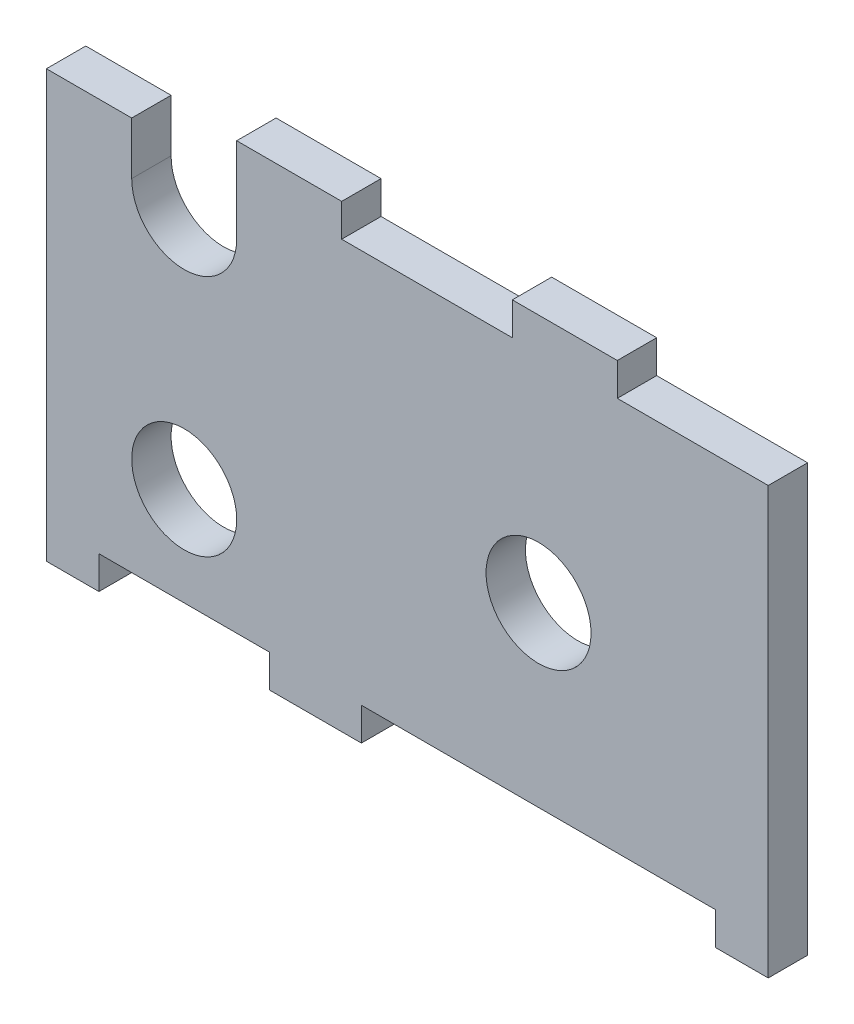
ISO-10303-21;
HEADER;
FILE_DESCRIPTION(('STEP AP214'),'2;1');
FILE_NAME('part.step','',(''),(''),'','','');
FILE_SCHEMA(('AUTOMOTIVE_DESIGN { 1 0 10303 214 1 1 1 1 }'));
ENDSEC;
DATA;
#1=APPLICATION_CONTEXT('core data for automotive mechanical design processes');
#2=APPLICATION_PROTOCOL_DEFINITION('international standard','automotive_design',2000,#1);
#3=PRODUCT_CONTEXT('',#1,'mechanical');
#4=PRODUCT('Part','Part','',(#3));
#5=PRODUCT_RELATED_PRODUCT_CATEGORY('part','',(#4));
#6=PRODUCT_DEFINITION_FORMATION('','',#4);
#7=PRODUCT_DEFINITION_CONTEXT('part definition',#1,'design');
#8=PRODUCT_DEFINITION('design','',#6,#7);
#9=PRODUCT_DEFINITION_SHAPE('','',#8);
#10=(LENGTH_UNIT() NAMED_UNIT(*) SI_UNIT(.MILLI.,.METRE.));
#11=(NAMED_UNIT(*) PLANE_ANGLE_UNIT() SI_UNIT($,.RADIAN.));
#12=(NAMED_UNIT(*) SI_UNIT($,.STERADIAN.) SOLID_ANGLE_UNIT());
#13=UNCERTAINTY_MEASURE_WITH_UNIT(LENGTH_MEASURE(1.E-05),#10,'distance_accuracy_value','');
#14=(GEOMETRIC_REPRESENTATION_CONTEXT(3) GLOBAL_UNCERTAINTY_ASSIGNED_CONTEXT((#13)) GLOBAL_UNIT_ASSIGNED_CONTEXT((#10,
#11,#12)) REPRESENTATION_CONTEXT('',''));
#15=CARTESIAN_POINT('',(0.,0.,0.));
#16=DIRECTION('',(0.,0.,1.));
#17=DIRECTION('',(1.,0.,0.));
#18=AXIS2_PLACEMENT_3D('',#15,#16,#17);
#19=CARTESIAN_POINT('',(-17.0000000000001,11.,3.));
#20=DIRECTION('',(0.,0.,1.));
#21=DIRECTION('',(1.,0.,0.));
#22=AXIS2_PLACEMENT_3D('',#19,#20,#21);
#23=PLANE('',#22);
#24=CARTESIAN_POINT('',(10.,-1.49999999999995,3.));
#25=DIRECTION('',(0.,0.,1.));
#26=DIRECTION('',(1.,0.,0.));
#27=AXIS2_PLACEMENT_3D('',#24,#25,#26);
#28=CIRCLE('',#27,4.);
#29=CARTESIAN_POINT('',(14.,-1.49999999999995,3.));
#30=VERTEX_POINT('',#29);
#31=EDGE_CURVE('E218',#30,#30,#28,.T.);
#32=ORIENTED_EDGE('',*,*,#31,.F.);
#33=EDGE_LOOP('',(#32));
#34=FACE_BOUND('',#33,.T.);
#35=CARTESIAN_POINT('',(-17.0000000000001,11.,3.));
#36=DIRECTION('',(0.,0.,-1.));
#37=DIRECTION('',(1.,0.,0.));
#38=AXIS2_PLACEMENT_3D('',#35,#36,#37);
#39=CIRCLE('',#38,4.);
#40=CARTESIAN_POINT('',(-13.0000000000001,11.,3.));
#41=VERTEX_POINT('',#40);
#42=CARTESIAN_POINT('',(-21.0000000000001,11.,3.));
#43=VERTEX_POINT('',#42);
#44=EDGE_CURVE('E257',#41,#43,#39,.T.);
#45=ORIENTED_EDGE('',*,*,#44,.T.);
#46=DIRECTION('',(0.,1.,0.));
#47=VECTOR('',#46,1.);
#48=CARTESIAN_POINT('',(-21.0000000000001,11.,3.));
#49=LINE('',#48,#47);
#50=CARTESIAN_POINT('',(-21.0000000000001,15.,3.));
#51=VERTEX_POINT('',#50);
#52=EDGE_CURVE('E135',#43,#51,#49,.T.);
#53=ORIENTED_EDGE('',*,*,#52,.T.);
#54=DIRECTION('',(-1.,0.,0.));
#55=VECTOR('',#54,1.);
#56=CARTESIAN_POINT('',(-21.0000000000001,15.,3.));
#57=LINE('',#56,#55);
#58=CARTESIAN_POINT('',(-27.5000000000001,15.,3.));
#59=VERTEX_POINT('',#58);
#60=EDGE_CURVE('E314',#51,#59,#57,.T.);
#61=ORIENTED_EDGE('',*,*,#60,.T.);
#62=DIRECTION('',(0.,-1.,0.));
#63=VECTOR('',#62,1.);
#64=CARTESIAN_POINT('',(-27.5000000000001,15.,3.));
#65=LINE('',#64,#63);
#66=CARTESIAN_POINT('',(-27.5000000000001,-17.5000000000001,3.));
#67=VERTEX_POINT('',#66);
#68=EDGE_CURVE('E333',#59,#67,#65,.T.);
#69=ORIENTED_EDGE('',*,*,#68,.T.);
#70=DIRECTION('',(1.,0.,0.));
#71=VECTOR('',#70,1.);
#72=CARTESIAN_POINT('',(-23.5000000000001,-17.5000000000001,3.));
#73=LINE('',#72,#71);
#74=CARTESIAN_POINT('',(-23.5000000000001,-17.5000000000001,3.));
#75=VERTEX_POINT('',#74);
#76=EDGE_CURVE('E330',#67,#75,#73,.T.);
#77=ORIENTED_EDGE('',*,*,#76,.T.);
#78=DIRECTION('',(0.,1.,0.));
#79=VECTOR('',#78,1.);
#80=CARTESIAN_POINT('',(-23.5000000000001,-17.5000000000001,3.));
#81=LINE('',#80,#79);
#82=CARTESIAN_POINT('',(-23.5000000000001,-14.9999999999999,3.));
#83=VERTEX_POINT('',#82);
#84=EDGE_CURVE('E332',#75,#83,#81,.T.);
#85=ORIENTED_EDGE('',*,*,#84,.T.);
#86=DIRECTION('',(1.,0.,0.));
#87=VECTOR('',#86,1.);
#88=CARTESIAN_POINT('',(-23.5000000000001,-14.9999999999999,3.));
#89=LINE('',#88,#87);
#90=CARTESIAN_POINT('',(-10.4999999999991,-14.9999999999999,3.));
#91=VERTEX_POINT('',#90);
#92=EDGE_CURVE('E335',#83,#91,#89,.T.);
#93=ORIENTED_EDGE('',*,*,#92,.T.);
#94=DIRECTION('',(0.,-1.,0.));
#95=VECTOR('',#94,1.);
#96=CARTESIAN_POINT('',(-10.4999999999991,-17.5000000000001,3.));
#97=LINE('',#96,#95);
#98=CARTESIAN_POINT('',(-10.4999999999991,-17.5000000000001,3.));
#99=VERTEX_POINT('',#98);
#100=EDGE_CURVE('E341',#91,#99,#97,.T.);
#101=ORIENTED_EDGE('',*,*,#100,.T.);
#102=DIRECTION('',(1.,0.,0.));
#103=VECTOR('',#102,1.);
#104=CARTESIAN_POINT('',(-3.49999999999961,-17.5000000000001,3.));
#105=LINE('',#104,#103);
#106=CARTESIAN_POINT('',(-3.49999999999961,-17.5000000000001,3.));
#107=VERTEX_POINT('',#106);
#108=EDGE_CURVE('E343',#99,#107,#105,.T.);
#109=ORIENTED_EDGE('',*,*,#108,.T.);
#110=DIRECTION('',(0.,1.,0.));
#111=VECTOR('',#110,1.);
#112=CARTESIAN_POINT('',(-3.49999999999961,-17.5000000000001,3.));
#113=LINE('',#112,#111);
#114=CARTESIAN_POINT('',(-3.49999999999961,-14.9999999999999,3.));
#115=VERTEX_POINT('',#114);
#116=EDGE_CURVE('E345',#107,#115,#113,.T.);
#117=ORIENTED_EDGE('',*,*,#116,.T.);
#118=DIRECTION('',(1.,0.,0.));
#119=VECTOR('',#118,1.);
#120=CARTESIAN_POINT('',(-3.49999999999961,-14.9999999999999,3.));
#121=LINE('',#120,#119);
#122=CARTESIAN_POINT('',(23.5000000000003,-14.9999999999999,3.));
#123=VERTEX_POINT('',#122);
#124=EDGE_CURVE('E347',#115,#123,#121,.T.);
#125=ORIENTED_EDGE('',*,*,#124,.T.);
#126=DIRECTION('',(0.,-1.,0.));
#127=VECTOR('',#126,1.);
#128=CARTESIAN_POINT('',(23.5000000000003,-17.5000000000001,3.));
#129=LINE('',#128,#127);
#130=CARTESIAN_POINT('',(23.5000000000003,-17.5000000000001,3.));
#131=VERTEX_POINT('',#130);
#132=EDGE_CURVE('E349',#123,#131,#129,.T.);
#133=ORIENTED_EDGE('',*,*,#132,.T.);
#134=DIRECTION('',(1.,0.,0.));
#135=VECTOR('',#134,1.);
#136=CARTESIAN_POINT('',(27.4999999999999,-17.5000000000001,3.));
#137=LINE('',#136,#135);
#138=CARTESIAN_POINT('',(27.4999999999999,-17.5000000000001,3.));
#139=VERTEX_POINT('',#138);
#140=EDGE_CURVE('E351',#131,#139,#137,.T.);
#141=ORIENTED_EDGE('',*,*,#140,.T.);
#142=DIRECTION('',(0.,1.,0.));
#143=VECTOR('',#142,1.);
#144=CARTESIAN_POINT('',(27.4999999999999,-17.5000000000001,3.));
#145=LINE('',#144,#143);
#146=CARTESIAN_POINT('',(27.4999999999999,15.,3.));
#147=VERTEX_POINT('',#146);
#148=EDGE_CURVE('E353',#139,#147,#145,.T.);
#149=ORIENTED_EDGE('',*,*,#148,.T.);
#150=DIRECTION('',(-1.,0.,0.));
#151=VECTOR('',#150,1.);
#152=CARTESIAN_POINT('',(27.4999999999999,15.,3.));
#153=LINE('',#152,#151);
#154=CARTESIAN_POINT('',(16.,15.,3.));
#155=VERTEX_POINT('',#154);
#156=EDGE_CURVE('E355',#147,#155,#153,.T.);
#157=ORIENTED_EDGE('',*,*,#156,.T.);
#158=DIRECTION('',(0.,1.,0.));
#159=VECTOR('',#158,1.);
#160=CARTESIAN_POINT('',(16.,17.5000000000001,3.));
#161=LINE('',#160,#159);
#162=CARTESIAN_POINT('',(16.,17.5000000000001,3.));
#163=VERTEX_POINT('',#162);
#164=EDGE_CURVE('E357',#155,#163,#161,.T.);
#165=ORIENTED_EDGE('',*,*,#164,.T.);
#166=DIRECTION('',(-1.,0.,0.));
#167=VECTOR('',#166,1.);
#168=CARTESIAN_POINT('',(8.00000000000023,17.5000000000001,3.));
#169=LINE('',#168,#167);
#170=CARTESIAN_POINT('',(8.00000000000023,17.5000000000001,3.));
#171=VERTEX_POINT('',#170);
#172=EDGE_CURVE('E359',#163,#171,#169,.T.);
#173=ORIENTED_EDGE('',*,*,#172,.T.);
#174=DIRECTION('',(0.,-1.,0.));
#175=VECTOR('',#174,1.);
#176=CARTESIAN_POINT('',(8.00000000000023,17.5000000000001,3.));
#177=LINE('',#176,#175);
#178=CARTESIAN_POINT('',(8.00000000000023,15.0000000000001,3.));
#179=VERTEX_POINT('',#178);
#180=EDGE_CURVE('E361',#171,#179,#177,.T.);
#181=ORIENTED_EDGE('',*,*,#180,.T.);
#182=DIRECTION('',(-1.,0.,0.));
#183=VECTOR('',#182,1.);
#184=CARTESIAN_POINT('',(8.00000000000023,15.0000000000001,3.));
#185=LINE('',#184,#183);
#186=CARTESIAN_POINT('',(-5.00000000000012,15.0000000000001,3.));
#187=VERTEX_POINT('',#186);
#188=EDGE_CURVE('E196',#179,#187,#185,.T.);
#189=ORIENTED_EDGE('',*,*,#188,.T.);
#190=DIRECTION('',(0.,1.,0.));
#191=VECTOR('',#190,1.);
#192=CARTESIAN_POINT('',(-5.00000000000012,17.5000000000001,3.));
#193=LINE('',#192,#191);
#194=CARTESIAN_POINT('',(-5.00000000000012,17.5000000000001,3.));
#195=VERTEX_POINT('',#194);
#196=EDGE_CURVE('E190',#187,#195,#193,.T.);
#197=ORIENTED_EDGE('',*,*,#196,.T.);
#198=DIRECTION('',(-1.,0.,0.));
#199=VECTOR('',#198,1.);
#200=CARTESIAN_POINT('',(-13.0000000000001,17.5000000000001,3.));
#201=LINE('',#200,#199);
#202=CARTESIAN_POINT('',(-13.0000000000001,17.5000000000001,3.));
#203=VERTEX_POINT('',#202);
#204=EDGE_CURVE('E194',#195,#203,#201,.T.);
#205=ORIENTED_EDGE('',*,*,#204,.T.);
#206=DIRECTION('',(0.,-1.,0.));
#207=VECTOR('',#206,1.);
#208=CARTESIAN_POINT('',(-13.0000000000001,17.5000000000001,3.));
#209=LINE('',#208,#207);
#210=EDGE_CURVE('E50',#203,#41,#209,.T.);
#211=ORIENTED_EDGE('',*,*,#210,.T.);
#212=EDGE_LOOP('',(#45,#53,#61,#69,#77,#85,#93,#101,#109,#117,#125,#133,#141,#149,#157,#165,
#173,#181,#189,#197,#205,#211));
#213=FACE_BOUND('',#212,.T.);
#214=CARTESIAN_POINT('',(-17.0000000000001,-7.49999999999995,3.));
#215=DIRECTION('',(0.,0.,1.));
#216=DIRECTION('',(1.,0.,0.));
#217=AXIS2_PLACEMENT_3D('',#214,#215,#216);
#218=CIRCLE('',#217,4.);
#219=CARTESIAN_POINT('',(-13.0000000000001,-7.49999999999995,3.));
#220=VERTEX_POINT('',#219);
#221=EDGE_CURVE('E403',#220,#220,#218,.T.);
#222=ORIENTED_EDGE('',*,*,#221,.F.);
#223=EDGE_LOOP('',(#222));
#224=FACE_BOUND('',#223,.T.);
#225=ADVANCED_FACE('F33',(#34,#213,#224),#23,.T.);
#226=CARTESIAN_POINT('',(-17.0000000000001,11.,0.));
#227=DIRECTION('',(0.,0.,1.));
#228=DIRECTION('',(1.,0.,0.));
#229=AXIS2_PLACEMENT_3D('',#226,#227,#228);
#230=PLANE('',#229);
#231=CARTESIAN_POINT('',(-17.0000000000001,11.,0.));
#232=DIRECTION('',(0.,0.,-1.));
#233=DIRECTION('',(1.,0.,0.));
#234=AXIS2_PLACEMENT_3D('',#231,#232,#233);
#235=CIRCLE('',#234,4.);
#236=CARTESIAN_POINT('',(-13.0000000000001,11.,0.));
#237=VERTEX_POINT('',#236);
#238=CARTESIAN_POINT('',(-21.0000000000001,11.,0.));
#239=VERTEX_POINT('',#238);
#240=EDGE_CURVE('E214',#237,#239,#235,.T.);
#241=ORIENTED_EDGE('',*,*,#240,.F.);
#242=DIRECTION('',(0.,-1.,0.));
#243=VECTOR('',#242,1.);
#244=CARTESIAN_POINT('',(-13.0000000000001,17.5000000000001,0.));
#245=LINE('',#244,#243);
#246=CARTESIAN_POINT('',(-13.0000000000001,17.5000000000001,0.));
#247=VERTEX_POINT('',#246);
#248=EDGE_CURVE('E127',#247,#237,#245,.T.);
#249=ORIENTED_EDGE('',*,*,#248,.F.);
#250=DIRECTION('',(-1.,0.,0.));
#251=VECTOR('',#250,1.);
#252=CARTESIAN_POINT('',(-13.0000000000001,17.5000000000001,0.));
#253=LINE('',#252,#251);
#254=CARTESIAN_POINT('',(-5.00000000000012,17.5000000000001,0.));
#255=VERTEX_POINT('',#254);
#256=EDGE_CURVE('E121',#255,#247,#253,.T.);
#257=ORIENTED_EDGE('',*,*,#256,.F.);
#258=DIRECTION('',(0.,1.,0.));
#259=VECTOR('',#258,1.);
#260=CARTESIAN_POINT('',(-5.00000000000012,17.5000000000001,0.));
#261=LINE('',#260,#259);
#262=CARTESIAN_POINT('',(-5.00000000000012,15.0000000000001,0.));
#263=VERTEX_POINT('',#262);
#264=EDGE_CURVE('E204',#263,#255,#261,.T.);
#265=ORIENTED_EDGE('',*,*,#264,.F.);
#266=DIRECTION('',(-1.,0.,0.));
#267=VECTOR('',#266,1.);
#268=CARTESIAN_POINT('',(8.00000000000023,15.0000000000001,0.));
#269=LINE('',#268,#267);
#270=CARTESIAN_POINT('',(8.00000000000023,15.0000000000001,0.));
#271=VERTEX_POINT('',#270);
#272=EDGE_CURVE('E252',#271,#263,#269,.T.);
#273=ORIENTED_EDGE('',*,*,#272,.F.);
#274=DIRECTION('',(0.,-1.,0.));
#275=VECTOR('',#274,1.);
#276=CARTESIAN_POINT('',(8.00000000000023,17.5000000000001,0.));
#277=LINE('',#276,#275);
#278=CARTESIAN_POINT('',(8.00000000000023,17.5000000000001,0.));
#279=VERTEX_POINT('',#278);
#280=EDGE_CURVE('E250',#279,#271,#277,.T.);
#281=ORIENTED_EDGE('',*,*,#280,.F.);
#282=DIRECTION('',(-1.,0.,0.));
#283=VECTOR('',#282,1.);
#284=CARTESIAN_POINT('',(8.00000000000023,17.5000000000001,0.));
#285=LINE('',#284,#283);
#286=CARTESIAN_POINT('',(16.,17.5000000000001,0.));
#287=VERTEX_POINT('',#286);
#288=EDGE_CURVE('E248',#287,#279,#285,.T.);
#289=ORIENTED_EDGE('',*,*,#288,.F.);
#290=DIRECTION('',(0.,1.,0.));
#291=VECTOR('',#290,1.);
#292=CARTESIAN_POINT('',(16.,17.5000000000001,0.));
#293=LINE('',#292,#291);
#294=CARTESIAN_POINT('',(16.,15.,0.));
#295=VERTEX_POINT('',#294);
#296=EDGE_CURVE('E246',#295,#287,#293,.T.);
#297=ORIENTED_EDGE('',*,*,#296,.F.);
#298=DIRECTION('',(-1.,0.,0.));
#299=VECTOR('',#298,1.);
#300=CARTESIAN_POINT('',(27.4999999999999,15.,0.));
#301=LINE('',#300,#299);
#302=CARTESIAN_POINT('',(27.4999999999999,15.,0.));
#303=VERTEX_POINT('',#302);
#304=EDGE_CURVE('E244',#303,#295,#301,.T.);
#305=ORIENTED_EDGE('',*,*,#304,.F.);
#306=DIRECTION('',(0.,1.,0.));
#307=VECTOR('',#306,1.);
#308=CARTESIAN_POINT('',(27.4999999999999,-17.5000000000001,0.));
#309=LINE('',#308,#307);
#310=CARTESIAN_POINT('',(27.4999999999999,-17.5000000000001,0.));
#311=VERTEX_POINT('',#310);
#312=EDGE_CURVE('E242',#311,#303,#309,.T.);
#313=ORIENTED_EDGE('',*,*,#312,.F.);
#314=DIRECTION('',(1.,0.,0.));
#315=VECTOR('',#314,1.);
#316=CARTESIAN_POINT('',(27.4999999999999,-17.5000000000001,0.));
#317=LINE('',#316,#315);
#318=CARTESIAN_POINT('',(23.5000000000003,-17.5000000000001,0.));
#319=VERTEX_POINT('',#318);
#320=EDGE_CURVE('E240',#319,#311,#317,.T.);
#321=ORIENTED_EDGE('',*,*,#320,.F.);
#322=DIRECTION('',(0.,-1.,0.));
#323=VECTOR('',#322,1.);
#324=CARTESIAN_POINT('',(23.5000000000003,-17.5000000000001,0.));
#325=LINE('',#324,#323);
#326=CARTESIAN_POINT('',(23.5000000000003,-14.9999999999999,0.));
#327=VERTEX_POINT('',#326);
#328=EDGE_CURVE('E238',#327,#319,#325,.T.);
#329=ORIENTED_EDGE('',*,*,#328,.F.);
#330=DIRECTION('',(1.,0.,0.));
#331=VECTOR('',#330,1.);
#332=CARTESIAN_POINT('',(-3.49999999999961,-14.9999999999999,0.));
#333=LINE('',#332,#331);
#334=CARTESIAN_POINT('',(-3.49999999999961,-14.9999999999999,0.));
#335=VERTEX_POINT('',#334);
#336=EDGE_CURVE('E236',#335,#327,#333,.T.);
#337=ORIENTED_EDGE('',*,*,#336,.F.);
#338=DIRECTION('',(0.,1.,0.));
#339=VECTOR('',#338,1.);
#340=CARTESIAN_POINT('',(-3.49999999999961,-17.5000000000001,0.));
#341=LINE('',#340,#339);
#342=CARTESIAN_POINT('',(-3.49999999999961,-17.5000000000001,0.));
#343=VERTEX_POINT('',#342);
#344=EDGE_CURVE('E234',#343,#335,#341,.T.);
#345=ORIENTED_EDGE('',*,*,#344,.F.);
#346=DIRECTION('',(1.,0.,0.));
#347=VECTOR('',#346,1.);
#348=CARTESIAN_POINT('',(-3.49999999999961,-17.5000000000001,0.));
#349=LINE('',#348,#347);
#350=CARTESIAN_POINT('',(-10.4999999999991,-17.5000000000001,0.));
#351=VERTEX_POINT('',#350);
#352=EDGE_CURVE('E232',#351,#343,#349,.T.);
#353=ORIENTED_EDGE('',*,*,#352,.F.);
#354=DIRECTION('',(0.,-1.,0.));
#355=VECTOR('',#354,1.);
#356=CARTESIAN_POINT('',(-10.4999999999991,-17.5000000000001,0.));
#357=LINE('',#356,#355);
#358=CARTESIAN_POINT('',(-10.4999999999991,-14.9999999999999,0.));
#359=VERTEX_POINT('',#358);
#360=EDGE_CURVE('E230',#359,#351,#357,.T.);
#361=ORIENTED_EDGE('',*,*,#360,.F.);
#362=DIRECTION('',(1.,0.,0.));
#363=VECTOR('',#362,1.);
#364=CARTESIAN_POINT('',(-23.5000000000001,-14.9999999999999,0.));
#365=LINE('',#364,#363);
#366=CARTESIAN_POINT('',(-23.5000000000001,-14.9999999999999,0.));
#367=VERTEX_POINT('',#366);
#368=EDGE_CURVE('E228',#367,#359,#365,.T.);
#369=ORIENTED_EDGE('',*,*,#368,.F.);
#370=DIRECTION('',(0.,1.,0.));
#371=VECTOR('',#370,1.);
#372=CARTESIAN_POINT('',(-23.5000000000001,-17.5000000000001,0.));
#373=LINE('',#372,#371);
#374=CARTESIAN_POINT('',(-23.5000000000001,-17.5000000000001,0.));
#375=VERTEX_POINT('',#374);
#376=EDGE_CURVE('E226',#375,#367,#373,.T.);
#377=ORIENTED_EDGE('',*,*,#376,.F.);
#378=DIRECTION('',(1.,0.,0.));
#379=VECTOR('',#378,1.);
#380=CARTESIAN_POINT('',(-23.5000000000001,-17.5000000000001,0.));
#381=LINE('',#380,#379);
#382=CARTESIAN_POINT('',(-27.5000000000001,-17.5000000000001,0.));
#383=VERTEX_POINT('',#382);
#384=EDGE_CURVE('E224',#383,#375,#381,.T.);
#385=ORIENTED_EDGE('',*,*,#384,.F.);
#386=DIRECTION('',(0.,-1.,0.));
#387=VECTOR('',#386,1.);
#388=CARTESIAN_POINT('',(-27.5000000000001,15.,0.));
#389=LINE('',#388,#387);
#390=CARTESIAN_POINT('',(-27.5000000000001,15.,0.));
#391=VERTEX_POINT('',#390);
#392=EDGE_CURVE('E222',#391,#383,#389,.T.);
#393=ORIENTED_EDGE('',*,*,#392,.F.);
#394=DIRECTION('',(-1.,0.,0.));
#395=VECTOR('',#394,1.);
#396=CARTESIAN_POINT('',(-21.0000000000001,15.,0.));
#397=LINE('',#396,#395);
#398=CARTESIAN_POINT('',(-21.0000000000001,15.,0.));
#399=VERTEX_POINT('',#398);
#400=EDGE_CURVE('E220',#399,#391,#397,.T.);
#401=ORIENTED_EDGE('',*,*,#400,.F.);
#402=DIRECTION('',(0.,1.,0.));
#403=VECTOR('',#402,1.);
#404=CARTESIAN_POINT('',(-21.0000000000001,11.,0.));
#405=LINE('',#404,#403);
#406=EDGE_CURVE('E217',#239,#399,#405,.T.);
#407=ORIENTED_EDGE('',*,*,#406,.F.);
#408=EDGE_LOOP('',(#241,#249,#257,#265,#273,#281,#289,#297,#305,#313,#321,#329,#337,#345,#353,
#361,#369,#377,#385,#393,#401,#407));
#409=FACE_BOUND('',#408,.T.);
#410=CARTESIAN_POINT('',(10.,-1.49999999999995,0.));
#411=DIRECTION('',(0.,0.,1.));
#412=DIRECTION('',(1.,0.,0.));
#413=AXIS2_PLACEMENT_3D('',#410,#411,#412);
#414=CIRCLE('',#413,4.);
#415=CARTESIAN_POINT('',(14.,-1.49999999999995,0.));
#416=VERTEX_POINT('',#415);
#417=EDGE_CURVE('E409',#416,#416,#414,.T.);
#418=ORIENTED_EDGE('',*,*,#417,.T.);
#419=EDGE_LOOP('',(#418));
#420=FACE_BOUND('',#419,.T.);
#421=CARTESIAN_POINT('',(-17.0000000000001,-7.49999999999995,0.));
#422=DIRECTION('',(0.,0.,1.));
#423=DIRECTION('',(1.,0.,0.));
#424=AXIS2_PLACEMENT_3D('',#421,#422,#423);
#425=CIRCLE('',#424,4.);
#426=CARTESIAN_POINT('',(-13.0000000000001,-7.49999999999995,0.));
#427=VERTEX_POINT('',#426);
#428=EDGE_CURVE('E406',#427,#427,#425,.T.);
#429=ORIENTED_EDGE('',*,*,#428,.T.);
#430=EDGE_LOOP('',(#429));
#431=FACE_BOUND('',#430,.T.);
#432=ADVANCED_FACE('F318',(#409,#420,#431),#230,.F.);
#433=CARTESIAN_POINT('',(-17.0000000000001,11.,3.));
#434=DIRECTION('',(0.,0.,-1.));
#435=DIRECTION('',(-1.,0.,0.));
#436=AXIS2_PLACEMENT_3D('',#433,#434,#435);
#437=CYLINDRICAL_SURFACE('',#436,4.);
#438=ORIENTED_EDGE('',*,*,#240,.T.);
#439=DIRECTION('',(0.,0.,-1.));
#440=VECTOR('',#439,1.);
#441=CARTESIAN_POINT('',(-21.0000000000001,11.,3.));
#442=LINE('',#441,#440);
#443=EDGE_CURVE('E11',#43,#239,#442,.T.);
#444=ORIENTED_EDGE('',*,*,#443,.F.);
#445=ORIENTED_EDGE('',*,*,#44,.F.);
#446=DIRECTION('',(0.,0.,-1.));
#447=VECTOR('',#446,1.);
#448=CARTESIAN_POINT('',(-13.0000000000001,11.,3.));
#449=LINE('',#448,#447);
#450=EDGE_CURVE('E210',#41,#237,#449,.T.);
#451=ORIENTED_EDGE('',*,*,#450,.T.);
#452=EDGE_LOOP('',(#438,#444,#445,#451));
#453=FACE_BOUND('',#452,.T.);
#454=ADVANCED_FACE('F35',(#453),#437,.F.);
#455=CARTESIAN_POINT('',(-21.0000000000001,11.,3.));
#456=DIRECTION('',(-1.,0.,0.));
#457=DIRECTION('',(0.,0.,1.));
#458=AXIS2_PLACEMENT_3D('',#455,#456,#457);
#459=PLANE('',#458);
#460=ORIENTED_EDGE('',*,*,#406,.T.);
#461=DIRECTION('',(0.,0.,-1.));
#462=VECTOR('',#461,1.);
#463=CARTESIAN_POINT('',(-21.0000000000001,15.,3.));
#464=LINE('',#463,#462);
#465=EDGE_CURVE('E42',#51,#399,#464,.T.);
#466=ORIENTED_EDGE('',*,*,#465,.F.);
#467=ORIENTED_EDGE('',*,*,#52,.F.);
#468=ORIENTED_EDGE('',*,*,#443,.T.);
#469=EDGE_LOOP('',(#460,#466,#467,#468));
#470=FACE_BOUND('',#469,.T.);
#471=ADVANCED_FACE('F602',(#470),#459,.F.);
#472=CARTESIAN_POINT('',(-21.0000000000001,15.,3.));
#473=DIRECTION('',(0.,-1.,0.));
#474=DIRECTION('',(1.,0.,0.));
#475=AXIS2_PLACEMENT_3D('',#472,#473,#474);
#476=PLANE('',#475);
#477=ORIENTED_EDGE('',*,*,#400,.T.);
#478=DIRECTION('',(0.,0.,-1.));
#479=VECTOR('',#478,1.);
#480=CARTESIAN_POINT('',(-27.5000000000001,15.,3.));
#481=LINE('',#480,#479);
#482=EDGE_CURVE('E306',#59,#391,#481,.T.);
#483=ORIENTED_EDGE('',*,*,#482,.F.);
#484=ORIENTED_EDGE('',*,*,#60,.F.);
#485=ORIENTED_EDGE('',*,*,#465,.T.);
#486=EDGE_LOOP('',(#477,#483,#484,#485));
#487=FACE_BOUND('',#486,.T.);
#488=ADVANCED_FACE('F312',(#487),#476,.F.);
#489=CARTESIAN_POINT('',(-27.5000000000001,15.,3.));
#490=DIRECTION('',(1.,0.,0.));
#491=DIRECTION('',(0.,1.,0.));
#492=AXIS2_PLACEMENT_3D('',#489,#490,#491);
#493=PLANE('',#492);
#494=ORIENTED_EDGE('',*,*,#392,.T.);
#495=DIRECTION('',(0.,0.,-1.));
#496=VECTOR('',#495,1.);
#497=CARTESIAN_POINT('',(-27.5000000000001,-17.5000000000001,3.));
#498=LINE('',#497,#496);
#499=EDGE_CURVE('E303',#67,#383,#498,.T.);
#500=ORIENTED_EDGE('',*,*,#499,.F.);
#501=ORIENTED_EDGE('',*,*,#68,.F.);
#502=ORIENTED_EDGE('',*,*,#482,.T.);
#503=EDGE_LOOP('',(#494,#500,#501,#502));
#504=FACE_BOUND('',#503,.T.);
#505=ADVANCED_FACE('F324',(#504),#493,.F.);
#506=CARTESIAN_POINT('',(-23.5000000000001,-17.5000000000001,3.));
#507=DIRECTION('',(0.,1.,0.));
#508=DIRECTION('',(0.,0.,1.));
#509=AXIS2_PLACEMENT_3D('',#506,#507,#508);
#510=PLANE('',#509);
#511=ORIENTED_EDGE('',*,*,#384,.T.);
#512=DIRECTION('',(0.,0.,-1.));
#513=VECTOR('',#512,1.);
#514=CARTESIAN_POINT('',(-23.5000000000001,-17.5000000000001,3.));
#515=LINE('',#514,#513);
#516=EDGE_CURVE('E300',#75,#375,#515,.T.);
#517=ORIENTED_EDGE('',*,*,#516,.F.);
#518=ORIENTED_EDGE('',*,*,#76,.F.);
#519=ORIENTED_EDGE('',*,*,#499,.T.);
#520=EDGE_LOOP('',(#511,#517,#518,#519));
#521=FACE_BOUND('',#520,.T.);
#522=ADVANCED_FACE('F328',(#521),#510,.F.);
#523=CARTESIAN_POINT('',(-23.5000000000001,-17.5000000000001,3.));
#524=DIRECTION('',(-1.,0.,0.));
#525=DIRECTION('',(0.,0.,1.));
#526=AXIS2_PLACEMENT_3D('',#523,#524,#525);
#527=PLANE('',#526);
#528=ORIENTED_EDGE('',*,*,#376,.T.);
#529=DIRECTION('',(0.,0.,-1.));
#530=VECTOR('',#529,1.);
#531=CARTESIAN_POINT('',(-23.5000000000001,-14.9999999999999,3.));
#532=LINE('',#531,#530);
#533=EDGE_CURVE('E297',#83,#367,#532,.T.);
#534=ORIENTED_EDGE('',*,*,#533,.F.);
#535=ORIENTED_EDGE('',*,*,#84,.F.);
#536=ORIENTED_EDGE('',*,*,#516,.T.);
#537=EDGE_LOOP('',(#528,#534,#535,#536));
#538=FACE_BOUND('',#537,.T.);
#539=ADVANCED_FACE('F567',(#538),#527,.F.);
#540=CARTESIAN_POINT('',(-23.5000000000001,-14.9999999999999,3.));
#541=DIRECTION('',(0.,1.,0.));
#542=DIRECTION('',(0.,0.,1.));
#543=AXIS2_PLACEMENT_3D('',#540,#541,#542);
#544=PLANE('',#543);
#545=ORIENTED_EDGE('',*,*,#368,.T.);
#546=DIRECTION('',(0.,0.,-1.));
#547=VECTOR('',#546,1.);
#548=CARTESIAN_POINT('',(-10.4999999999991,-14.9999999999999,3.));
#549=LINE('',#548,#547);
#550=EDGE_CURVE('E294',#91,#359,#549,.T.);
#551=ORIENTED_EDGE('',*,*,#550,.F.);
#552=ORIENTED_EDGE('',*,*,#92,.F.);
#553=ORIENTED_EDGE('',*,*,#533,.T.);
#554=EDGE_LOOP('',(#545,#551,#552,#553));
#555=FACE_BOUND('',#554,.T.);
#556=ADVANCED_FACE('F557',(#555),#544,.F.);
#557=CARTESIAN_POINT('',(-10.4999999999991,-17.5000000000001,3.));
#558=DIRECTION('',(1.,0.,0.));
#559=DIRECTION('',(0.,0.,-1.));
#560=AXIS2_PLACEMENT_3D('',#557,#558,#559);
#561=PLANE('',#560);
#562=ORIENTED_EDGE('',*,*,#360,.T.);
#563=DIRECTION('',(0.,0.,-1.));
#564=VECTOR('',#563,1.);
#565=CARTESIAN_POINT('',(-10.4999999999991,-17.5000000000001,3.));
#566=LINE('',#565,#564);
#567=EDGE_CURVE('E291',#99,#351,#566,.T.);
#568=ORIENTED_EDGE('',*,*,#567,.F.);
#569=ORIENTED_EDGE('',*,*,#100,.F.);
#570=ORIENTED_EDGE('',*,*,#550,.T.);
#571=EDGE_LOOP('',(#562,#568,#569,#570));
#572=FACE_BOUND('',#571,.T.);
#573=ADVANCED_FACE('F547',(#572),#561,.F.);
#574=CARTESIAN_POINT('',(-3.49999999999961,-17.5000000000001,3.));
#575=DIRECTION('',(0.,1.,0.));
#576=DIRECTION('',(-1.,0.,0.));
#577=AXIS2_PLACEMENT_3D('',#574,#575,#576);
#578=PLANE('',#577);
#579=ORIENTED_EDGE('',*,*,#352,.T.);
#580=DIRECTION('',(0.,0.,-1.));
#581=VECTOR('',#580,1.);
#582=CARTESIAN_POINT('',(-3.49999999999961,-17.5000000000001,3.));
#583=LINE('',#582,#581);
#584=EDGE_CURVE('E288',#107,#343,#583,.T.);
#585=ORIENTED_EDGE('',*,*,#584,.F.);
#586=ORIENTED_EDGE('',*,*,#108,.F.);
#587=ORIENTED_EDGE('',*,*,#567,.T.);
#588=EDGE_LOOP('',(#579,#585,#586,#587));
#589=FACE_BOUND('',#588,.T.);
#590=ADVANCED_FACE('F537',(#589),#578,.F.);
#591=CARTESIAN_POINT('',(-3.49999999999961,-17.5000000000001,3.));
#592=DIRECTION('',(-1.,0.,0.));
#593=DIRECTION('',(0.,-1.,0.));
#594=AXIS2_PLACEMENT_3D('',#591,#592,#593);
#595=PLANE('',#594);
#596=ORIENTED_EDGE('',*,*,#344,.T.);
#597=DIRECTION('',(0.,0.,-1.));
#598=VECTOR('',#597,1.);
#599=CARTESIAN_POINT('',(-3.49999999999961,-14.9999999999999,3.));
#600=LINE('',#599,#598);
#601=EDGE_CURVE('E285',#115,#335,#600,.T.);
#602=ORIENTED_EDGE('',*,*,#601,.F.);
#603=ORIENTED_EDGE('',*,*,#116,.F.);
#604=ORIENTED_EDGE('',*,*,#584,.T.);
#605=EDGE_LOOP('',(#596,#602,#603,#604));
#606=FACE_BOUND('',#605,.T.);
#607=ADVANCED_FACE('F527',(#606),#595,.F.);
#608=CARTESIAN_POINT('',(-3.49999999999961,-14.9999999999999,3.));
#609=DIRECTION('',(0.,1.,0.));
#610=DIRECTION('',(0.,0.,1.));
#611=AXIS2_PLACEMENT_3D('',#608,#609,#610);
#612=PLANE('',#611);
#613=ORIENTED_EDGE('',*,*,#336,.T.);
#614=DIRECTION('',(0.,0.,-1.));
#615=VECTOR('',#614,1.);
#616=CARTESIAN_POINT('',(23.5000000000003,-14.9999999999999,3.));
#617=LINE('',#616,#615);
#618=EDGE_CURVE('E282',#123,#327,#617,.T.);
#619=ORIENTED_EDGE('',*,*,#618,.F.);
#620=ORIENTED_EDGE('',*,*,#124,.F.);
#621=ORIENTED_EDGE('',*,*,#601,.T.);
#622=EDGE_LOOP('',(#613,#619,#620,#621));
#623=FACE_BOUND('',#622,.T.);
#624=ADVANCED_FACE('F517',(#623),#612,.F.);
#625=CARTESIAN_POINT('',(23.5000000000003,-17.5000000000001,3.));
#626=DIRECTION('',(1.,0.,0.));
#627=DIRECTION('',(0.,0.,-1.));
#628=AXIS2_PLACEMENT_3D('',#625,#626,#627);
#629=PLANE('',#628);
#630=ORIENTED_EDGE('',*,*,#328,.T.);
#631=DIRECTION('',(0.,0.,-1.));
#632=VECTOR('',#631,1.);
#633=CARTESIAN_POINT('',(23.5000000000003,-17.5000000000001,3.));
#634=LINE('',#633,#632);
#635=EDGE_CURVE('E279',#131,#319,#634,.T.);
#636=ORIENTED_EDGE('',*,*,#635,.F.);
#637=ORIENTED_EDGE('',*,*,#132,.F.);
#638=ORIENTED_EDGE('',*,*,#618,.T.);
#639=EDGE_LOOP('',(#630,#636,#637,#638));
#640=FACE_BOUND('',#639,.T.);
#641=ADVANCED_FACE('F507',(#640),#629,.F.);
#642=CARTESIAN_POINT('',(27.4999999999999,-17.5000000000001,3.));
#643=DIRECTION('',(0.,1.,0.));
#644=DIRECTION('',(-1.,0.,0.));
#645=AXIS2_PLACEMENT_3D('',#642,#643,#644);
#646=PLANE('',#645);
#647=ORIENTED_EDGE('',*,*,#320,.T.);
#648=DIRECTION('',(0.,0.,-1.));
#649=VECTOR('',#648,1.);
#650=CARTESIAN_POINT('',(27.4999999999999,-17.5000000000001,3.));
#651=LINE('',#650,#649);
#652=EDGE_CURVE('E276',#139,#311,#651,.T.);
#653=ORIENTED_EDGE('',*,*,#652,.F.);
#654=ORIENTED_EDGE('',*,*,#140,.F.);
#655=ORIENTED_EDGE('',*,*,#635,.T.);
#656=EDGE_LOOP('',(#647,#653,#654,#655));
#657=FACE_BOUND('',#656,.T.);
#658=ADVANCED_FACE('F497',(#657),#646,.F.);
#659=CARTESIAN_POINT('',(27.4999999999999,-17.5000000000001,3.));
#660=DIRECTION('',(-1.,0.,0.));
#661=DIRECTION('',(0.,0.,1.));
#662=AXIS2_PLACEMENT_3D('',#659,#660,#661);
#663=PLANE('',#662);
#664=ORIENTED_EDGE('',*,*,#312,.T.);
#665=DIRECTION('',(0.,0.,-1.));
#666=VECTOR('',#665,1.);
#667=CARTESIAN_POINT('',(27.4999999999999,15.,3.));
#668=LINE('',#667,#666);
#669=EDGE_CURVE('E273',#147,#303,#668,.T.);
#670=ORIENTED_EDGE('',*,*,#669,.F.);
#671=ORIENTED_EDGE('',*,*,#148,.F.);
#672=ORIENTED_EDGE('',*,*,#652,.T.);
#673=EDGE_LOOP('',(#664,#670,#671,#672));
#674=FACE_BOUND('',#673,.T.);
#675=ADVANCED_FACE('F487',(#674),#663,.F.);
#676=CARTESIAN_POINT('',(27.4999999999999,15.,3.));
#677=DIRECTION('',(0.,-1.,0.));
#678=DIRECTION('',(1.,0.,0.));
#679=AXIS2_PLACEMENT_3D('',#676,#677,#678);
#680=PLANE('',#679);
#681=ORIENTED_EDGE('',*,*,#304,.T.);
#682=DIRECTION('',(0.,0.,-1.));
#683=VECTOR('',#682,1.);
#684=CARTESIAN_POINT('',(16.,15.,3.));
#685=LINE('',#684,#683);
#686=EDGE_CURVE('E270',#155,#295,#685,.T.);
#687=ORIENTED_EDGE('',*,*,#686,.F.);
#688=ORIENTED_EDGE('',*,*,#156,.F.);
#689=ORIENTED_EDGE('',*,*,#669,.T.);
#690=EDGE_LOOP('',(#681,#687,#688,#689));
#691=FACE_BOUND('',#690,.T.);
#692=ADVANCED_FACE('F477',(#691),#680,.F.);
#693=CARTESIAN_POINT('',(16.,17.5000000000001,3.));
#694=DIRECTION('',(-1.,0.,0.));
#695=DIRECTION('',(0.,0.,1.));
#696=AXIS2_PLACEMENT_3D('',#693,#694,#695);
#697=PLANE('',#696);
#698=ORIENTED_EDGE('',*,*,#296,.T.);
#699=DIRECTION('',(0.,0.,-1.));
#700=VECTOR('',#699,1.);
#701=CARTESIAN_POINT('',(16.,17.5000000000001,3.));
#702=LINE('',#701,#700);
#703=EDGE_CURVE('E267',#163,#287,#702,.T.);
#704=ORIENTED_EDGE('',*,*,#703,.F.);
#705=ORIENTED_EDGE('',*,*,#164,.F.);
#706=ORIENTED_EDGE('',*,*,#686,.T.);
#707=EDGE_LOOP('',(#698,#704,#705,#706));
#708=FACE_BOUND('',#707,.T.);
#709=ADVANCED_FACE('F467',(#708),#697,.F.);
#710=CARTESIAN_POINT('',(8.00000000000023,17.5000000000001,3.));
#711=DIRECTION('',(0.,-1.,0.));
#712=DIRECTION('',(1.,0.,0.));
#713=AXIS2_PLACEMENT_3D('',#710,#711,#712);
#714=PLANE('',#713);
#715=ORIENTED_EDGE('',*,*,#288,.T.);
#716=DIRECTION('',(0.,0.,-1.));
#717=VECTOR('',#716,1.);
#718=CARTESIAN_POINT('',(8.00000000000023,17.5000000000001,3.));
#719=LINE('',#718,#717);
#720=EDGE_CURVE('E264',#171,#279,#719,.T.);
#721=ORIENTED_EDGE('',*,*,#720,.F.);
#722=ORIENTED_EDGE('',*,*,#172,.F.);
#723=ORIENTED_EDGE('',*,*,#703,.T.);
#724=EDGE_LOOP('',(#715,#721,#722,#723));
#725=FACE_BOUND('',#724,.T.);
#726=ADVANCED_FACE('F458',(#725),#714,.F.);
#727=CARTESIAN_POINT('',(8.00000000000023,17.5000000000001,3.));
#728=DIRECTION('',(1.,0.,0.));
#729=DIRECTION('',(0.,1.,0.));
#730=AXIS2_PLACEMENT_3D('',#727,#728,#729);
#731=PLANE('',#730);
#732=ORIENTED_EDGE('',*,*,#280,.T.);
#733=DIRECTION('',(0.,0.,-1.));
#734=VECTOR('',#733,1.);
#735=CARTESIAN_POINT('',(8.00000000000023,15.0000000000001,3.));
#736=LINE('',#735,#734);
#737=EDGE_CURVE('E261',#179,#271,#736,.T.);
#738=ORIENTED_EDGE('',*,*,#737,.F.);
#739=ORIENTED_EDGE('',*,*,#180,.F.);
#740=ORIENTED_EDGE('',*,*,#720,.T.);
#741=EDGE_LOOP('',(#732,#738,#739,#740));
#742=FACE_BOUND('',#741,.T.);
#743=ADVANCED_FACE('F367',(#742),#731,.F.);
#744=CARTESIAN_POINT('',(8.00000000000023,15.0000000000001,3.));
#745=DIRECTION('',(0.,-1.,0.));
#746=DIRECTION('',(0.,0.,-1.));
#747=AXIS2_PLACEMENT_3D('',#744,#745,#746);
#748=PLANE('',#747);
#749=ORIENTED_EDGE('',*,*,#272,.T.);
#750=DIRECTION('',(0.,0.,-1.));
#751=VECTOR('',#750,1.);
#752=CARTESIAN_POINT('',(-5.00000000000012,15.0000000000001,3.));
#753=LINE('',#752,#751);
#754=EDGE_CURVE('E205',#187,#263,#753,.T.);
#755=ORIENTED_EDGE('',*,*,#754,.F.);
#756=ORIENTED_EDGE('',*,*,#188,.F.);
#757=ORIENTED_EDGE('',*,*,#737,.T.);
#758=EDGE_LOOP('',(#749,#755,#756,#757));
#759=FACE_BOUND('',#758,.T.);
#760=ADVANCED_FACE('F371',(#759),#748,.F.);
#761=CARTESIAN_POINT('',(-5.00000000000012,17.5000000000001,3.));
#762=DIRECTION('',(-1.,0.,0.));
#763=DIRECTION('',(0.,0.,1.));
#764=AXIS2_PLACEMENT_3D('',#761,#762,#763);
#765=PLANE('',#764);
#766=ORIENTED_EDGE('',*,*,#264,.T.);
#767=DIRECTION('',(0.,0.,-1.));
#768=VECTOR('',#767,1.);
#769=CARTESIAN_POINT('',(-5.00000000000012,17.5000000000001,3.));
#770=LINE('',#769,#768);
#771=EDGE_CURVE('E201',#195,#255,#770,.T.);
#772=ORIENTED_EDGE('',*,*,#771,.F.);
#773=ORIENTED_EDGE('',*,*,#196,.F.);
#774=ORIENTED_EDGE('',*,*,#754,.T.);
#775=EDGE_LOOP('',(#766,#772,#773,#774));
#776=FACE_BOUND('',#775,.T.);
#777=ADVANCED_FACE('F202',(#776),#765,.F.);
#778=CARTESIAN_POINT('',(-13.0000000000001,17.5000000000001,3.));
#779=DIRECTION('',(0.,-1.,0.));
#780=DIRECTION('',(1.,0.,0.));
#781=AXIS2_PLACEMENT_3D('',#778,#779,#780);
#782=PLANE('',#781);
#783=ORIENTED_EDGE('',*,*,#256,.T.);
#784=DIRECTION('',(0.,0.,-1.));
#785=VECTOR('',#784,1.);
#786=CARTESIAN_POINT('',(-13.0000000000001,17.5000000000001,3.));
#787=LINE('',#786,#785);
#788=EDGE_CURVE('E206',#203,#247,#787,.T.);
#789=ORIENTED_EDGE('',*,*,#788,.F.);
#790=ORIENTED_EDGE('',*,*,#204,.F.);
#791=ORIENTED_EDGE('',*,*,#771,.T.);
#792=EDGE_LOOP('',(#783,#789,#790,#791));
#793=FACE_BOUND('',#792,.T.);
#794=ADVANCED_FACE('F208',(#793),#782,.F.);
#795=CARTESIAN_POINT('',(-13.0000000000001,17.5000000000001,3.));
#796=DIRECTION('',(1.,0.,0.));
#797=DIRECTION('',(0.,0.,-1.));
#798=AXIS2_PLACEMENT_3D('',#795,#796,#797);
#799=PLANE('',#798);
#800=ORIENTED_EDGE('',*,*,#248,.T.);
#801=ORIENTED_EDGE('',*,*,#450,.F.);
#802=ORIENTED_EDGE('',*,*,#210,.F.);
#803=ORIENTED_EDGE('',*,*,#788,.T.);
#804=EDGE_LOOP('',(#800,#801,#802,#803));
#805=FACE_BOUND('',#804,.T.);
#806=ADVANCED_FACE('F375',(#805),#799,.F.);
#807=CARTESIAN_POINT('',(10.,-1.49999999999995,3.));
#808=DIRECTION('',(0.,0.,-1.));
#809=DIRECTION('',(-1.,0.,0.));
#810=AXIS2_PLACEMENT_3D('',#807,#808,#809);
#811=CYLINDRICAL_SURFACE('',#810,4.);
#812=ORIENTED_EDGE('',*,*,#31,.T.);
#813=EDGE_LOOP('',(#812));
#814=FACE_BOUND('',#813,.T.);
#815=ORIENTED_EDGE('',*,*,#417,.F.);
#816=EDGE_LOOP('',(#815));
#817=FACE_BOUND('',#816,.T.);
#818=ADVANCED_FACE('F377',(#814,#817),#811,.F.);
#819=CARTESIAN_POINT('',(-17.0000000000001,-7.49999999999995,3.));
#820=DIRECTION('',(0.,0.,-1.));
#821=DIRECTION('',(-1.,0.,0.));
#822=AXIS2_PLACEMENT_3D('',#819,#820,#821);
#823=CYLINDRICAL_SURFACE('',#822,4.);
#824=ORIENTED_EDGE('',*,*,#221,.T.);
#825=EDGE_LOOP('',(#824));
#826=FACE_BOUND('',#825,.T.);
#827=ORIENTED_EDGE('',*,*,#428,.F.);
#828=EDGE_LOOP('',(#827));
#829=FACE_BOUND('',#828,.T.);
#830=ADVANCED_FACE('F383',(#826,#829),#823,.F.);
#831=CLOSED_SHELL('',(#225,#432,#454,#471,#488,#505,#522,#539,#556,#573,#590,#607,#624,#641,
#658,#675,#692,#709,#726,#743,#760,#777,#794,#806,#818,#830));
#832=MANIFOLD_SOLID_BREP('B2',#831);
#833=ADVANCED_BREP_SHAPE_REPRESENTATION('',(#18,#832),#14);
#834=SHAPE_DEFINITION_REPRESENTATION(#9,#833);
ENDSEC;
END-ISO-10303-21;
